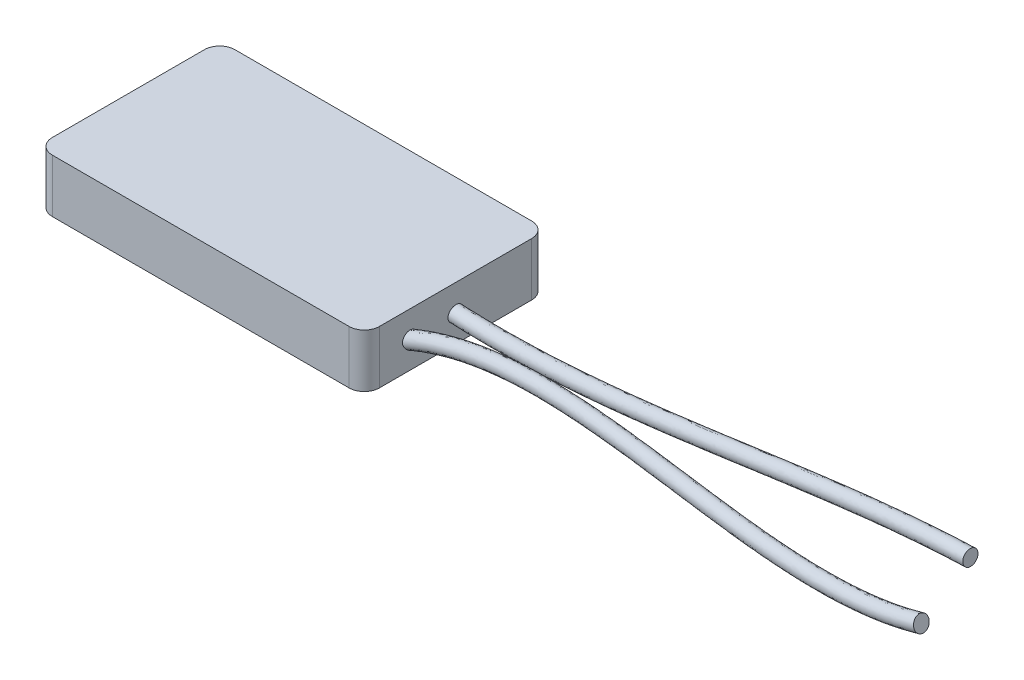
ISO-10303-21;
HEADER;
FILE_DESCRIPTION(('STEP AP214'),'2;1');
FILE_NAME('part.step','',(''),(''),'','','');
FILE_SCHEMA(('AUTOMOTIVE_DESIGN { 1 0 10303 214 1 1 1 1 }'));
ENDSEC;
DATA;
#1=APPLICATION_CONTEXT('core data for automotive mechanical design processes');
#2=APPLICATION_PROTOCOL_DEFINITION('international standard','automotive_design',2000,#1);
#3=PRODUCT_CONTEXT('',#1,'mechanical');
#4=PRODUCT('Part','Part','',(#3));
#5=PRODUCT_RELATED_PRODUCT_CATEGORY('part','',(#4));
#6=PRODUCT_DEFINITION_FORMATION('','',#4);
#7=PRODUCT_DEFINITION_CONTEXT('part definition',#1,'design');
#8=PRODUCT_DEFINITION('design','',#6,#7);
#9=PRODUCT_DEFINITION_SHAPE('','',#8);
#10=(LENGTH_UNIT() NAMED_UNIT(*) SI_UNIT(.MILLI.,.METRE.));
#11=(NAMED_UNIT(*) PLANE_ANGLE_UNIT() SI_UNIT($,.RADIAN.));
#12=(NAMED_UNIT(*) SI_UNIT($,.STERADIAN.) SOLID_ANGLE_UNIT());
#13=UNCERTAINTY_MEASURE_WITH_UNIT(LENGTH_MEASURE(1.E-05),#10,'distance_accuracy_value','');
#14=(GEOMETRIC_REPRESENTATION_CONTEXT(3) GLOBAL_UNCERTAINTY_ASSIGNED_CONTEXT((#13)) GLOBAL_UNIT_ASSIGNED_CONTEXT((#10,
#11,#12)) REPRESENTATION_CONTEXT('',''));
#15=CARTESIAN_POINT('',(0.,0.,0.));
#16=DIRECTION('',(0.,0.,1.));
#17=DIRECTION('',(1.,0.,0.));
#18=AXIS2_PLACEMENT_3D('',#15,#16,#17);
#19=CARTESIAN_POINT('',(10.75,3.5,4.99999999999999));
#20=DIRECTION('',(-1.,0.,0.));
#21=DIRECTION('',(0.,0.,1.));
#22=AXIS2_PLACEMENT_3D('',#19,#20,#21);
#23=PLANE('',#22);
#24=DIRECTION('',(0.,0.,1.));
#25=VECTOR('',#24,1.);
#26=CARTESIAN_POINT('',(10.75,1.74999999999996,4.99999999999999));
#27=LINE('',#26,#25);
#28=CARTESIAN_POINT('',(10.75,1.74999999999996,-0.5));
#29=VERTEX_POINT('',#28);
#30=CARTESIAN_POINT('',(10.75,1.74999999999996,0.5));
#31=VERTEX_POINT('',#30);
#32=EDGE_CURVE('E136',#29,#31,#27,.T.);
#33=ORIENTED_EDGE('',*,*,#32,.F.);
#34=CARTESIAN_POINT('',(10.75,1.74999999999996,-0.5));
#35=CARTESIAN_POINT('',(10.75,1.72181741917708,-0.500023785054452));
#36=CARTESIAN_POINT('',(10.75,1.69364178108827,-0.497623974888977));
#37=CARTESIAN_POINT('',(10.75,1.63810632293729,-0.488152143746487));
#38=CARTESIAN_POINT('',(10.75,1.6107459464219,-0.481083389594952));
#39=CARTESIAN_POINT('',(10.75,1.55758872581576,-0.462443770775175));
#40=CARTESIAN_POINT('',(10.75,1.5317926313849,-0.450870766911956));
#41=CARTESIAN_POINT('',(10.75,1.48251569340367,-0.423559948086439));
#42=CARTESIAN_POINT('',(10.75,1.45903437558522,-0.407822988709773));
#43=CARTESIAN_POINT('',(10.75,1.4150747842776,-0.372646198933193));
#44=CARTESIAN_POINT('',(10.75,1.39459319502428,-0.353210512444183));
#45=CARTESIAN_POINT('',(10.75,1.35715874709685,-0.311145551769514));
#46=CARTESIAN_POINT('',(10.75,1.34021087632415,-0.288511838059506));
#47=CARTESIAN_POINT('',(10.75,1.31040421899986,-0.240777292531718));
#48=CARTESIAN_POINT('',(10.75,1.29753496887906,-0.215682993678822));
#49=CARTESIAN_POINT('',(10.75,1.27617514541598,-0.163646107788774));
#50=CARTESIAN_POINT('',(10.75,1.26769189050958,-0.13670051600709));
#51=CARTESIAN_POINT('',(10.75,1.25538594858809,-0.0817929829988339));
#52=CARTESIAN_POINT('',(10.75,1.25155872614001,-0.0538320582000836));
#53=CARTESIAN_POINT('',(10.75,1.24866165947707,0.0022882190570369));
#54=CARTESIAN_POINT('',(10.75,1.24958388776724,0.0304471625701267));
#55=CARTESIAN_POINT('',(10.75,1.25614451312447,0.086239560447965));
#56=CARTESIAN_POINT('',(10.75,1.26178773330775,0.113872447837342));
#57=CARTESIAN_POINT('',(10.75,1.27762456987448,0.167761575046105));
#58=CARTESIAN_POINT('',(10.75,1.28781210716232,0.194019601803649));
#59=CARTESIAN_POINT('',(10.75,1.31245707275448,0.244478763463588));
#60=CARTESIAN_POINT('',(10.75,1.32691839325167,0.268677997409771));
#61=CARTESIAN_POINT('',(10.75,1.35969462626511,0.314306493153973));
#62=CARTESIAN_POINT('',(10.75,1.37800936324578,0.335735881055674));
#63=CARTESIAN_POINT('',(10.75,1.41798952484676,0.375238260330686));
#64=CARTESIAN_POINT('',(10.75,1.43965786576218,0.393308300019311));
#65=CARTESIAN_POINT('',(10.75,1.48571741787069,0.425557599165117));
#66=CARTESIAN_POINT('',(10.75,1.51010851256204,0.439737025004995));
#67=CARTESIAN_POINT('',(10.75,1.5609677266025,0.463830597988614));
#68=CARTESIAN_POINT('',(10.75,1.5874396417955,0.473736725781164));
#69=CARTESIAN_POINT('',(10.75,1.64163719447065,0.488949348212263));
#70=CARTESIAN_POINT('',(10.75,1.66936085955286,0.494262830519985));
#71=CARTESIAN_POINT('',(10.75,1.71482097317971,0.499076419694177));
#72=CARTESIAN_POINT('',(10.75,1.73241510990828,0.500007441371513));
#73=CARTESIAN_POINT('',(10.75,1.74999999999996,0.5));
#74=B_SPLINE_CURVE_WITH_KNOTS('',3,(#34,#35,#36,#37,#38,#39,#40,#41,#42,#43,#44,#45,#46,#47,#48,
#49,#50,#51,#52,#53,#54,#55,#56,#57,#58,#59,#60,#61,#62,#63,#64,#65,#66,#67,#68,#69,#70,#71,#72,
#73),.UNSPECIFIED.,.F.,.F.,(4,2,2,2,2,2,2,2,2,2,2,2,2,2,2,2,2,2,2,4),(0.,0.0844358442030547,
0.168812671767809,0.253229621258723,0.337629238691978,0.42193484888099,0.506358664056075,
0.590564105770283,0.674909602189799,0.759172871853978,0.843295540012755,0.927504255680808,
1.01160065860107,1.09577388652779,1.17994328092171,1.26418628462032,1.34842568509224,
1.43282249026711,1.51709065927045,1.5698452343646),.UNSPECIFIED.);
#75=EDGE_CURVE('E161',#29,#31,#74,.T.);
#76=ORIENTED_EDGE('',*,*,#75,.T.);
#77=EDGE_LOOP('',(#33,#76));
#78=FACE_BOUND('',#77,.T.);
#79=DIRECTION('',(0.,0.,-1.));
#80=VECTOR('',#79,1.);
#81=CARTESIAN_POINT('',(10.75,0.,4.99999999999999));
#82=LINE('',#81,#80);
#83=CARTESIAN_POINT('',(10.75,0.,4.99999999999999));
#84=VERTEX_POINT('',#83);
#85=CARTESIAN_POINT('',(10.75,0.,-4.99999999999999));
#86=VERTEX_POINT('',#85);
#87=EDGE_CURVE('E307',#84,#86,#82,.T.);
#88=ORIENTED_EDGE('',*,*,#87,.T.);
#89=DIRECTION('',(0.,-1.,0.));
#90=VECTOR('',#89,1.);
#91=CARTESIAN_POINT('',(10.75,3.5,-4.99999999999999));
#92=LINE('',#91,#90);
#93=CARTESIAN_POINT('',(10.75,3.5,-4.99999999999999));
#94=VERTEX_POINT('',#93);
#95=EDGE_CURVE('E266',#94,#86,#92,.T.);
#96=ORIENTED_EDGE('',*,*,#95,.F.);
#97=DIRECTION('',(0.,0.,-1.));
#98=VECTOR('',#97,1.);
#99=CARTESIAN_POINT('',(10.75,3.5,4.99999999999999));
#100=LINE('',#99,#98);
#101=CARTESIAN_POINT('',(10.75,3.5,4.99999999999999));
#102=VERTEX_POINT('',#101);
#103=EDGE_CURVE('E294',#102,#94,#100,.T.);
#104=ORIENTED_EDGE('',*,*,#103,.F.);
#105=DIRECTION('',(0.,-1.,0.));
#106=VECTOR('',#105,1.);
#107=CARTESIAN_POINT('',(10.75,3.5,4.99999999999999));
#108=LINE('',#107,#106);
#109=EDGE_CURVE('E269',#102,#84,#108,.T.);
#110=ORIENTED_EDGE('',*,*,#109,.T.);
#111=EDGE_LOOP('',(#88,#96,#104,#110));
#112=FACE_BOUND('',#111,.T.);
#113=DIRECTION('',(0.,0.,-1.));
#114=VECTOR('',#113,1.);
#115=CARTESIAN_POINT('',(10.75,1.74999999999997,4.99999999999999));
#116=LINE('',#115,#114);
#117=CARTESIAN_POINT('',(10.75,1.74999999999997,3.5));
#118=VERTEX_POINT('',#117);
#119=CARTESIAN_POINT('',(10.75,1.75000000001283,2.5));
#120=VERTEX_POINT('',#119);
#121=EDGE_CURVE('E12',#118,#120,#116,.T.);
#122=ORIENTED_EDGE('',*,*,#121,.F.);
#123=CARTESIAN_POINT('',(10.75,1.75000000001284,3.5));
#124=CARTESIAN_POINT('',(10.75,1.78247486726504,3.50001489875257));
#125=CARTESIAN_POINT('',(10.75,1.81496040205785,3.49731725958554));
#126=CARTESIAN_POINT('',(10.75,1.87910119957976,3.48657182431885));
#127=CARTESIAN_POINT('',(10.75,1.91075461664858,3.47851303249838));
#128=CARTESIAN_POINT('',(10.75,1.97228181478387,3.45710572348813));
#129=CARTESIAN_POINT('',(10.75,2.00215301831415,3.44374974881708));
#130=CARTESIAN_POINT('',(10.75,2.05905736625552,3.41198817333901));
#131=CARTESIAN_POINT('',(10.75,2.08609325783668,3.3935875240595));
#132=CARTESIAN_POINT('',(10.75,2.13517858757019,3.35308277613139));
#133=CARTESIAN_POINT('',(10.75,2.15740008311934,3.3311877312923));
#134=CARTESIAN_POINT('',(10.75,2.19746915146851,3.28369324570609));
#135=CARTESIAN_POINT('',(10.75,2.21531802488397,3.25809491009708));
#136=CARTESIAN_POINT('',(10.75,2.24461536706111,3.2061133072119));
#137=CARTESIAN_POINT('',(10.75,2.25645851366234,3.17995240395459));
#138=CARTESIAN_POINT('',(10.75,2.27522600537008,3.12592481507081));
#139=CARTESIAN_POINT('',(10.7500000000001,2.28215301752151,3.09805906326605));
#140=CARTESIAN_POINT('',(10.7500000000001,2.29048409431419,3.04341059821431));
#141=CARTESIAN_POINT('',(10.75,2.29222407305103,3.01667867750367));
#142=CARTESIAN_POINT('',(10.75,2.29106879265793,2.96331752052784));
#143=CARTESIAN_POINT('',(10.75,2.2881743433816,2.93668826713692));
#144=CARTESIAN_POINT('',(10.75,2.27800221284413,2.88497191873653));
#145=CARTESIAN_POINT('',(10.75,2.2708347870596,2.85986296751515));
#146=CARTESIAN_POINT('',(10.75,2.2524752194338,2.81112828282459));
#147=CARTESIAN_POINT('',(10.75,2.2412774951945,2.78750466027437));
#148=CARTESIAN_POINT('',(10.75,2.21494901364384,2.74181202907296));
#149=CARTESIAN_POINT('',(10.75,2.19973083360408,2.7197935272547));
#150=CARTESIAN_POINT('',(10.75,2.16600894861398,2.6784313360214));
#151=CARTESIAN_POINT('',(10.75,2.14750363903483,2.65908896121178));
#152=CARTESIAN_POINT('',(10.75,2.1065395901233,2.62234996815571));
#153=CARTESIAN_POINT('',(10.75,2.08390741097479,2.60514693591553));
#154=CARTESIAN_POINT('',(10.75,2.03626982321762,2.57449008066574));
#155=CARTESIAN_POINT('',(10.7500000000002,2.01126623266467,2.56103341613854));
#156=CARTESIAN_POINT('',(10.7499999999998,1.95753337829621,2.53715255279583));
#157=CARTESIAN_POINT('',(10.7499999999992,1.9286654561424,2.52704044764955));
#158=CARTESIAN_POINT('',(10.7500000000008,1.86973017876078,2.51150322257651));
#159=CARTESIAN_POINT('',(10.7500000000028,1.83966413654318,2.50607311185676));
#160=CARTESIAN_POINT('',(10.7499999999997,1.7896414493491,2.50099799137806));
#161=CARTESIAN_POINT('',(10.7499999999968,1.76981520893317,2.49999601549057));
#162=CARTESIAN_POINT('',(10.7499999999908,1.75000000001088,2.5));
#163=B_SPLINE_CURVE_WITH_KNOTS('',3,(#123,#124,#125,#126,#127,#128,#129,#130,#131,#132,#133,
#134,#135,#136,#137,#138,#139,#140,#141,#142,#143,#144,#145,#146,#147,#148,#149,#150,#151,#152,
#153,#154,#155,#156,#157,#158,#159,#160,#161,#162),.UNSPECIFIED.,.F.,.F.,(4,2,2,2,2,2,2,2,2,2,2,
2,2,2,2,2,2,2,2,4),(0.,0.097331307208857,0.194862858868278,0.292532207597433,0.390106031501713,
0.483195811236801,0.576257868153428,0.661956560685618,0.747608725331935,0.827578585697753,
0.90753447307428,0.985511497212213,1.06359694623097,1.1435444898537,1.2235311680629,
1.30845115088392,1.393306547644,1.48467600421991,1.57594794427673,1.63539528805274),.UNSPECIFIED.);
#164=EDGE_CURVE('E67',#118,#120,#163,.T.);
#165=ORIENTED_EDGE('',*,*,#164,.T.);
#166=EDGE_LOOP('',(#122,#165));
#167=FACE_BOUND('',#166,.T.);
#168=ADVANCED_FACE('F59',(#78,#112,#167),#23,.F.);
#169=CARTESIAN_POINT('',(-9.75,3.5,5.));
#170=DIRECTION('',(0.,-1.,0.));
#171=DIRECTION('',(0.,0.,-1.));
#172=AXIS2_PLACEMENT_3D('',#169,#170,#171);
#173=CYLINDRICAL_SURFACE('',#172,1.);
#174=CARTESIAN_POINT('',(-9.75,0.,5.));
#175=DIRECTION('',(0.,1.,0.));
#176=DIRECTION('',(0.,0.,-1.));
#177=AXIS2_PLACEMENT_3D('',#174,#175,#176);
#178=CIRCLE('',#177,1.);
#179=CARTESIAN_POINT('',(-10.75,0.,4.99999999999999));
#180=VERTEX_POINT('',#179);
#181=CARTESIAN_POINT('',(-9.74999999999999,0.,6.));
#182=VERTEX_POINT('',#181);
#183=EDGE_CURVE('E283',#180,#182,#178,.T.);
#184=ORIENTED_EDGE('',*,*,#183,.T.);
#185=DIRECTION('',(0.,-1.,0.));
#186=VECTOR('',#185,1.);
#187=CARTESIAN_POINT('',(-9.74999999999999,3.5,6.));
#188=LINE('',#187,#186);
#189=CARTESIAN_POINT('',(-9.74999999999999,3.5,6.));
#190=VERTEX_POINT('',#189);
#191=EDGE_CURVE('E274',#190,#182,#188,.T.);
#192=ORIENTED_EDGE('',*,*,#191,.F.);
#193=CARTESIAN_POINT('',(-9.75,3.5,5.));
#194=DIRECTION('',(0.,1.,0.));
#195=DIRECTION('',(0.,0.,-1.));
#196=AXIS2_PLACEMENT_3D('',#193,#194,#195);
#197=CIRCLE('',#196,1.);
#198=CARTESIAN_POINT('',(-10.75,3.5,4.99999999999999));
#199=VERTEX_POINT('',#198);
#200=EDGE_CURVE('E256',#199,#190,#197,.T.);
#201=ORIENTED_EDGE('',*,*,#200,.F.);
#202=DIRECTION('',(0.,-1.,0.));
#203=VECTOR('',#202,1.);
#204=CARTESIAN_POINT('',(-10.75,3.5,4.99999999999999));
#205=LINE('',#204,#203);
#206=EDGE_CURVE('E260',#199,#180,#205,.T.);
#207=ORIENTED_EDGE('',*,*,#206,.T.);
#208=EDGE_LOOP('',(#184,#192,#201,#207));
#209=FACE_BOUND('',#208,.T.);
#210=ADVANCED_FACE('F61',(#209),#173,.T.);
#211=CARTESIAN_POINT('',(-9.74999999999999,3.5,6.));
#212=DIRECTION('',(0.,0.,-1.));
#213=DIRECTION('',(-1.,0.,0.));
#214=AXIS2_PLACEMENT_3D('',#211,#212,#213);
#215=PLANE('',#214);
#216=DIRECTION('',(1.,0.,0.));
#217=VECTOR('',#216,1.);
#218=CARTESIAN_POINT('',(-9.74999999999999,0.,6.));
#219=LINE('',#218,#217);
#220=CARTESIAN_POINT('',(9.74999999999999,0.,6.));
#221=VERTEX_POINT('',#220);
#222=EDGE_CURVE('E303',#182,#221,#219,.T.);
#223=ORIENTED_EDGE('',*,*,#222,.T.);
#224=DIRECTION('',(0.,-1.,0.));
#225=VECTOR('',#224,1.);
#226=CARTESIAN_POINT('',(9.74999999999999,3.5,6.));
#227=LINE('',#226,#225);
#228=CARTESIAN_POINT('',(9.74999999999999,3.5,6.));
#229=VERTEX_POINT('',#228);
#230=EDGE_CURVE('E272',#229,#221,#227,.T.);
#231=ORIENTED_EDGE('',*,*,#230,.F.);
#232=DIRECTION('',(1.,0.,0.));
#233=VECTOR('',#232,1.);
#234=CARTESIAN_POINT('',(-9.74999999999999,3.5,6.));
#235=LINE('',#234,#233);
#236=EDGE_CURVE('E290',#190,#229,#235,.T.);
#237=ORIENTED_EDGE('',*,*,#236,.F.);
#238=ORIENTED_EDGE('',*,*,#191,.T.);
#239=EDGE_LOOP('',(#223,#231,#237,#238));
#240=FACE_BOUND('',#239,.T.);
#241=ADVANCED_FACE('F149',(#240),#215,.F.);
#242=CARTESIAN_POINT('',(9.75,3.5,5.));
#243=DIRECTION('',(0.,-1.,0.));
#244=DIRECTION('',(0.,0.,-1.));
#245=AXIS2_PLACEMENT_3D('',#242,#243,#244);
#246=CYLINDRICAL_SURFACE('',#245,1.);
#247=CARTESIAN_POINT('',(9.75,0.,5.));
#248=DIRECTION('',(0.,1.,0.));
#249=DIRECTION('',(0.,0.,1.));
#250=AXIS2_PLACEMENT_3D('',#247,#248,#249);
#251=CIRCLE('',#250,1.);
#252=EDGE_CURVE('E305',#221,#84,#251,.T.);
#253=ORIENTED_EDGE('',*,*,#252,.T.);
#254=ORIENTED_EDGE('',*,*,#109,.F.);
#255=CARTESIAN_POINT('',(9.75,3.5,5.));
#256=DIRECTION('',(0.,1.,0.));
#257=DIRECTION('',(0.,0.,1.));
#258=AXIS2_PLACEMENT_3D('',#255,#256,#257);
#259=CIRCLE('',#258,1.);
#260=EDGE_CURVE('E292',#229,#102,#259,.T.);
#261=ORIENTED_EDGE('',*,*,#260,.F.);
#262=ORIENTED_EDGE('',*,*,#230,.T.);
#263=EDGE_LOOP('',(#253,#254,#261,#262));
#264=FACE_BOUND('',#263,.T.);
#265=ADVANCED_FACE('F158',(#264),#246,.T.);
#266=CARTESIAN_POINT('',(9.75,3.5,-5.));
#267=DIRECTION('',(0.,-1.,0.));
#268=DIRECTION('',(0.,0.,-1.));
#269=AXIS2_PLACEMENT_3D('',#266,#267,#268);
#270=CYLINDRICAL_SURFACE('',#269,1.);
#271=CARTESIAN_POINT('',(9.75,0.,-5.));
#272=DIRECTION('',(0.,1.,0.));
#273=DIRECTION('',(0.,0.,-1.));
#274=AXIS2_PLACEMENT_3D('',#271,#272,#273);
#275=CIRCLE('',#274,1.);
#276=CARTESIAN_POINT('',(9.74999999999999,0.,-6.));
#277=VERTEX_POINT('',#276);
#278=EDGE_CURVE('E245',#86,#277,#275,.T.);
#279=ORIENTED_EDGE('',*,*,#278,.T.);
#280=DIRECTION('',(0.,-1.,0.));
#281=VECTOR('',#280,1.);
#282=CARTESIAN_POINT('',(9.74999999999999,3.5,-6.));
#283=LINE('',#282,#281);
#284=CARTESIAN_POINT('',(9.74999999999999,3.5,-6.));
#285=VERTEX_POINT('',#284);
#286=EDGE_CURVE('E241',#285,#277,#283,.T.);
#287=ORIENTED_EDGE('',*,*,#286,.F.);
#288=CARTESIAN_POINT('',(9.75,3.5,-5.));
#289=DIRECTION('',(0.,1.,0.));
#290=DIRECTION('',(0.,0.,-1.));
#291=AXIS2_PLACEMENT_3D('',#288,#289,#290);
#292=CIRCLE('',#291,1.);
#293=EDGE_CURVE('E296',#94,#285,#292,.T.);
#294=ORIENTED_EDGE('',*,*,#293,.F.);
#295=ORIENTED_EDGE('',*,*,#95,.T.);
#296=EDGE_LOOP('',(#279,#287,#294,#295));
#297=FACE_BOUND('',#296,.T.);
#298=ADVANCED_FACE('F156',(#297),#270,.T.);
#299=CARTESIAN_POINT('',(-9.74999999999999,3.5,-6.));
#300=DIRECTION('',(0.,0.,1.));
#301=DIRECTION('',(1.,0.,0.));
#302=AXIS2_PLACEMENT_3D('',#299,#300,#301);
#303=PLANE('',#302);
#304=DIRECTION('',(-1.,0.,0.));
#305=VECTOR('',#304,1.);
#306=CARTESIAN_POINT('',(-9.74999999999999,0.,-6.));
#307=LINE('',#306,#305);
#308=CARTESIAN_POINT('',(-9.74999999999999,0.,-6.));
#309=VERTEX_POINT('',#308);
#310=EDGE_CURVE('E235',#277,#309,#307,.T.);
#311=ORIENTED_EDGE('',*,*,#310,.T.);
#312=DIRECTION('',(0.,-1.,0.));
#313=VECTOR('',#312,1.);
#314=CARTESIAN_POINT('',(-9.74999999999999,3.5,-6.));
#315=LINE('',#314,#313);
#316=CARTESIAN_POINT('',(-9.74999999999999,3.5,-6.));
#317=VERTEX_POINT('',#316);
#318=EDGE_CURVE('E238',#317,#309,#315,.T.);
#319=ORIENTED_EDGE('',*,*,#318,.F.);
#320=DIRECTION('',(-1.,0.,0.));
#321=VECTOR('',#320,1.);
#322=CARTESIAN_POINT('',(-9.74999999999999,3.5,-6.));
#323=LINE('',#322,#321);
#324=EDGE_CURVE('E298',#285,#317,#323,.T.);
#325=ORIENTED_EDGE('',*,*,#324,.F.);
#326=ORIENTED_EDGE('',*,*,#286,.T.);
#327=EDGE_LOOP('',(#311,#319,#325,#326));
#328=FACE_BOUND('',#327,.T.);
#329=ADVANCED_FACE('F224',(#328),#303,.F.);
#330=CARTESIAN_POINT('',(-9.75,3.5,-5.));
#331=DIRECTION('',(0.,-1.,0.));
#332=DIRECTION('',(0.,0.,-1.));
#333=AXIS2_PLACEMENT_3D('',#330,#331,#332);
#334=CYLINDRICAL_SURFACE('',#333,1.);
#335=CARTESIAN_POINT('',(-9.75,0.,-5.));
#336=DIRECTION('',(0.,1.,0.));
#337=DIRECTION('',(0.,0.,-1.));
#338=AXIS2_PLACEMENT_3D('',#335,#336,#337);
#339=CIRCLE('',#338,1.);
#340=CARTESIAN_POINT('',(-10.75,0.,-4.99999999999999));
#341=VERTEX_POINT('',#340);
#342=EDGE_CURVE('E244',#309,#341,#339,.T.);
#343=ORIENTED_EDGE('',*,*,#342,.T.);
#344=DIRECTION('',(0.,-1.,0.));
#345=VECTOR('',#344,1.);
#346=CARTESIAN_POINT('',(-10.75,3.5,-4.99999999999999));
#347=LINE('',#346,#345);
#348=CARTESIAN_POINT('',(-10.75,3.5,-4.99999999999999));
#349=VERTEX_POINT('',#348);
#350=EDGE_CURVE('E250',#349,#341,#347,.T.);
#351=ORIENTED_EDGE('',*,*,#350,.F.);
#352=CARTESIAN_POINT('',(-9.75,3.5,-5.));
#353=DIRECTION('',(0.,1.,0.));
#354=DIRECTION('',(0.,0.,-1.));
#355=AXIS2_PLACEMENT_3D('',#352,#353,#354);
#356=CIRCLE('',#355,1.);
#357=EDGE_CURVE('E249',#317,#349,#356,.T.);
#358=ORIENTED_EDGE('',*,*,#357,.F.);
#359=ORIENTED_EDGE('',*,*,#318,.T.);
#360=EDGE_LOOP('',(#343,#351,#358,#359));
#361=FACE_BOUND('',#360,.T.);
#362=ADVANCED_FACE('F221',(#361),#334,.T.);
#363=CARTESIAN_POINT('',(-10.75,3.5,4.99999999999999));
#364=DIRECTION('',(1.,0.,0.));
#365=DIRECTION('',(0.,0.,-1.));
#366=AXIS2_PLACEMENT_3D('',#363,#364,#365);
#367=PLANE('',#366);
#368=DIRECTION('',(0.,0.,1.));
#369=VECTOR('',#368,1.);
#370=CARTESIAN_POINT('',(-10.75,0.,4.99999999999999));
#371=LINE('',#370,#369);
#372=EDGE_CURVE('E254',#341,#180,#371,.T.);
#373=ORIENTED_EDGE('',*,*,#372,.T.);
#374=ORIENTED_EDGE('',*,*,#206,.F.);
#375=DIRECTION('',(0.,0.,1.));
#376=VECTOR('',#375,1.);
#377=CARTESIAN_POINT('',(-10.75,3.5,4.99999999999999));
#378=LINE('',#377,#376);
#379=EDGE_CURVE('E263',#349,#199,#378,.T.);
#380=ORIENTED_EDGE('',*,*,#379,.F.);
#381=ORIENTED_EDGE('',*,*,#350,.T.);
#382=EDGE_LOOP('',(#373,#374,#380,#381));
#383=FACE_BOUND('',#382,.T.);
#384=ADVANCED_FACE('F214',(#383),#367,.F.);
#385=CARTESIAN_POINT('',(-9.75,3.5,5.));
#386=DIRECTION('',(0.,-1.,0.));
#387=DIRECTION('',(0.,0.,-1.));
#388=AXIS2_PLACEMENT_3D('',#385,#386,#387);
#389=PLANE('',#388);
#390=ORIENTED_EDGE('',*,*,#200,.T.);
#391=ORIENTED_EDGE('',*,*,#236,.T.);
#392=ORIENTED_EDGE('',*,*,#260,.T.);
#393=ORIENTED_EDGE('',*,*,#103,.T.);
#394=ORIENTED_EDGE('',*,*,#293,.T.);
#395=ORIENTED_EDGE('',*,*,#324,.T.);
#396=ORIENTED_EDGE('',*,*,#357,.T.);
#397=ORIENTED_EDGE('',*,*,#379,.T.);
#398=EDGE_LOOP('',(#390,#391,#392,#393,#394,#395,#396,#397));
#399=FACE_BOUND('',#398,.T.);
#400=ADVANCED_FACE('F211',(#399),#389,.F.);
#401=CARTESIAN_POINT('',(-9.75,0.,5.));
#402=DIRECTION('',(0.,-1.,0.));
#403=DIRECTION('',(0.,0.,-1.));
#404=AXIS2_PLACEMENT_3D('',#401,#402,#403);
#405=PLANE('',#404);
#406=ORIENTED_EDGE('',*,*,#183,.F.);
#407=ORIENTED_EDGE('',*,*,#372,.F.);
#408=ORIENTED_EDGE('',*,*,#342,.F.);
#409=ORIENTED_EDGE('',*,*,#310,.F.);
#410=ORIENTED_EDGE('',*,*,#278,.F.);
#411=ORIENTED_EDGE('',*,*,#87,.F.);
#412=ORIENTED_EDGE('',*,*,#252,.F.);
#413=ORIENTED_EDGE('',*,*,#222,.F.);
#414=EDGE_LOOP('',(#406,#407,#408,#409,#410,#411,#412,#413));
#415=FACE_BOUND('',#414,.T.);
#416=ADVANCED_FACE('F209',(#415),#405,.T.);
#417=CARTESIAN_POINT('',(10.75,1.75,0.));
#418=DIRECTION('',(0.998880508858223,-0.0473046406089031,0.));
#419=DIRECTION('',(0.0473046406089031,0.998880508858223,0.));
#420=AXIS2_PLACEMENT_3D('',#417,#418,#419);
#421=PLANE('',#420);
#422=CARTESIAN_POINT('',(10.75,1.75,0.));
#423=DIRECTION('',(0.998880508858223,-0.0473046406089031,0.));
#424=DIRECTION('',(0.0473046406089031,0.998880508858223,0.));
#425=AXIS2_PLACEMENT_3D('',#422,#423,#424);
#426=CIRCLE('',#425,0.5);
#427=EDGE_CURVE('E79',#29,#31,#426,.T.);
#428=ORIENTED_EDGE('',*,*,#427,.F.);
#429=ORIENTED_EDGE('',*,*,#32,.T.);
#430=EDGE_LOOP('',(#428,#429));
#431=FACE_BOUND('',#430,.T.);
#432=ADVANCED_FACE('F197',(#431),#421,.F.);
#433=CARTESIAN_POINT('',(10.7736523203045,2.24944025442911,0.));
#434=CARTESIAN_POINT('',(22.028626523367,1.71643104916205,0.));
#435=CARTESIAN_POINT('',(33.1547737074439,4.84297756328523,0.));
#436=CARTESIAN_POINT('',(44.5599889746685,5.26163674732241,0.));
#437=CARTESIAN_POINT('',(10.7736523203045,2.24944025442911,1.));
#438=CARTESIAN_POINT('',(22.028626523367,1.71643104916205,1.));
#439=CARTESIAN_POINT('',(33.1547737074439,4.84297756328523,1.));
#440=CARTESIAN_POINT('',(44.5599889746685,5.26163674732241,1.));
#441=CARTESIAN_POINT('',(10.7263476796955,1.25055974557089,1.));
#442=CARTESIAN_POINT('',(22.1954655465855,0.707409198296256,1.));
#443=CARTESIAN_POINT('',(33.3515644026737,3.84952779585448,1.));
#444=CARTESIAN_POINT('',(44.5966719651242,4.26230979471319,1.));
#445=CARTESIAN_POINT('',(10.7263476796955,1.25055974557089,0.));
#446=CARTESIAN_POINT('',(22.1954655465855,0.707409198296256,0.));
#447=CARTESIAN_POINT('',(33.3515644026737,3.84952779584711,0.));
#448=CARTESIAN_POINT('',(44.5966719651242,4.26230979471319,0.));
#449=CARTESIAN_POINT('',(10.7263476796955,1.25055974557089,-1.));
#450=CARTESIAN_POINT('',(22.1954655465855,0.707409198296255,-1.));
#451=CARTESIAN_POINT('',(33.3515644026737,3.84952779583973,-1.));
#452=CARTESIAN_POINT('',(44.5966719651242,4.26230979471319,-1.));
#453=CARTESIAN_POINT('',(10.7736523203045,2.24944025442911,-1.));
#454=CARTESIAN_POINT('',(22.028626523367,1.71643104916205,-1.));
#455=CARTESIAN_POINT('',(33.1547737074439,4.84297756328523,-1.));
#456=CARTESIAN_POINT('',(44.5599889746685,5.26163674732241,-1.));
#457=CARTESIAN_POINT('',(10.7736523203045,2.24944025442911,0.));
#458=CARTESIAN_POINT('',(22.028626523367,1.71643104916205,0.));
#459=CARTESIAN_POINT('',(33.1547737074439,4.84297756328523,0.));
#460=CARTESIAN_POINT('',(44.5599889746685,5.26163674732241,0.));
#461=(BOUNDED_SURFACE() B_SPLINE_SURFACE(3,3,((#433,#434,#435,#436),(#437,#438,#439,#440),(#441,
#442,#443,#444),(#445,#446,#447,#448),(#449,#450,#451,#452),(#453,#454,#455,#456),(#457,#458,
#459,#460)),.UNSPECIFIED.,.T.,.F.,.F.) B_SPLINE_SURFACE_WITH_KNOTS((4,3,4),(4,4),(0.,0.5,1.),
(0.,1.),.UNSPECIFIED.) GEOMETRIC_REPRESENTATION_ITEM() RATIONAL_B_SPLINE_SURFACE(((1.,1.,1.,1.),
(0.333333333333333,0.333333333333333,0.333333333333333,0.333333333333333),(0.333333333333333,
0.333333333333333,0.333333333333333,0.333333333333333),(1.,1.,1.,1.),(0.333333333333333,
0.333333333333333,0.333333333333333,0.333333333333333),(0.333333333333333,0.333333333333333,
0.333333333333333,0.333333333333333),(1.,1.,1.,1.))) REPRESENTATION_ITEM('') SURFACE());
#462=CARTESIAN_POINT('',(44.5783304698963,4.76197327101779,0.));
#463=DIRECTION('',(0.99932695260922,0.0366829904556461,0.));
#464=DIRECTION('',(-0.0366829904556461,0.99932695260922,0.));
#465=AXIS2_PLACEMENT_3D('',#462,#463,#464);
#466=CIRCLE('',#465,0.5);
#467=CARTESIAN_POINT('',(44.5599889746685,5.2616367473224,0.));
#468=VERTEX_POINT('',#467);
#469=EDGE_CURVE('E280',#468,#468,#466,.T.);
#470=ORIENTED_EDGE('',*,*,#469,.F.);
#471=EDGE_LOOP('',(#470));
#472=FACE_BOUND('',#471,.T.);
#473=ORIENTED_EDGE('',*,*,#75,.F.);
#474=ORIENTED_EDGE('',*,*,#427,.T.);
#475=EDGE_LOOP('',(#473,#474));
#476=FACE_BOUND('',#475,.T.);
#477=ADVANCED_FACE('F191',(#472,#476),#461,.T.);
#478=CARTESIAN_POINT('',(44.5783304698963,4.76197327101779,0.));
#479=DIRECTION('',(0.99932695260922,0.0366829904556461,0.));
#480=DIRECTION('',(-0.0366829904556461,0.99932695260922,0.));
#481=AXIS2_PLACEMENT_3D('',#478,#479,#480);
#482=PLANE('',#481);
#483=ORIENTED_EDGE('',*,*,#469,.T.);
#484=EDGE_LOOP('',(#483));
#485=FACE_BOUND('',#484,.T.);
#486=ADVANCED_FACE('F190',(#485),#482,.T.);
#487=CARTESIAN_POINT('',(10.75,1.74999999999996,3.));
#488=DIRECTION('',(0.920878760093869,0.389849085170119,0.));
#489=DIRECTION('',(-0.389849085170119,0.920878760093869,0.));
#490=AXIS2_PLACEMENT_3D('',#487,#488,#489);
#491=PLANE('',#490);
#492=CARTESIAN_POINT('',(10.75,1.74999999999996,3.));
#493=DIRECTION('',(0.920878760093869,0.389849085170119,0.));
#494=DIRECTION('',(-0.389849085170119,0.920878760093869,0.));
#495=AXIS2_PLACEMENT_3D('',#492,#493,#494);
#496=CIRCLE('',#495,0.5);
#497=EDGE_CURVE('E73',#118,#120,#496,.T.);
#498=ORIENTED_EDGE('',*,*,#497,.F.);
#499=ORIENTED_EDGE('',*,*,#121,.T.);
#500=EDGE_LOOP('',(#498,#499));
#501=FACE_BOUND('',#500,.T.);
#502=ADVANCED_FACE('F138',(#501),#491,.F.);
#503=CARTESIAN_POINT('',(10.5550754574149,2.2104393800469,3.));
#504=CARTESIAN_POINT('',(16.2283669651612,4.61219691280045,2.99999999998046));
#505=CARTESIAN_POINT('',(21.9279819284803,3.95115605243397,3.));
#506=CARTESIAN_POINT('',(33.1682848778749,2.30363142676226,3.));
#507=CARTESIAN_POINT('',(38.7216085325346,1.3230332400631,3.));
#508=CARTESIAN_POINT('',(44.219909658997,2.88532612925528,3.));
#509=CARTESIAN_POINT('',(10.5550754574149,2.2104393800469,4.));
#510=CARTESIAN_POINT('',(16.2283669651612,4.61219691280045,3.9999999999772));
#511=CARTESIAN_POINT('',(21.9279819284803,3.95115605243397,4.));
#512=CARTESIAN_POINT('',(33.1682848778749,2.30363142676226,4.));
#513=CARTESIAN_POINT('',(38.7216085325346,1.3230332400631,4.));
#514=CARTESIAN_POINT('',(44.219909658997,2.88532612925528,4.));
#515=CARTESIAN_POINT('',(10.9449245425851,1.28956061995303,4.));
#516=CARTESIAN_POINT('',(16.3358022809053,3.57175979795564,3.9999999999772));
#517=CARTESIAN_POINT('',(21.8038365232562,2.95866767716839,4.));
#518=CARTESIAN_POINT('',(33.0023834095006,1.31726336177864,4.));
#519=CARTESIAN_POINT('',(38.7202603844469,0.283065586378242,4.));
#520=CARTESIAN_POINT('',(44.4932313526725,1.92340344433389,4.));
#521=CARTESIAN_POINT('',(10.9449245425851,1.28956061995303,3.));
#522=CARTESIAN_POINT('',(16.3358022809053,3.57175979795564,2.99999999998046));
#523=CARTESIAN_POINT('',(21.8038365232562,2.95866767716716,3.));
#524=CARTESIAN_POINT('',(33.0023834095006,1.31726336177987,3.));
#525=CARTESIAN_POINT('',(38.7202603844469,0.283065586378242,3.));
#526=CARTESIAN_POINT('',(44.4932313526725,1.92340344433389,3.));
#527=CARTESIAN_POINT('',(10.9449245425851,1.28956061995303,2.));
#528=CARTESIAN_POINT('',(16.3358022809053,3.57175979795564,1.99999999998372));
#529=CARTESIAN_POINT('',(21.8038365232562,2.95866767716593,2.));
#530=CARTESIAN_POINT('',(33.0023834095006,1.3172633617811,2.));
#531=CARTESIAN_POINT('',(38.7202603844469,0.283065586378242,2.));
#532=CARTESIAN_POINT('',(44.4932313526725,1.92340344433389,2.));
#533=CARTESIAN_POINT('',(10.5550754574149,2.2104393800469,2.));
#534=CARTESIAN_POINT('',(16.2283669651612,4.61219691280045,1.99999999998372));
#535=CARTESIAN_POINT('',(21.9279819284803,3.95115605243397,2.));
#536=CARTESIAN_POINT('',(33.1682848778749,2.30363142676226,2.));
#537=CARTESIAN_POINT('',(38.7216085325346,1.3230332400631,2.));
#538=CARTESIAN_POINT('',(44.219909658997,2.88532612925528,2.));
#539=CARTESIAN_POINT('',(10.5550754574149,2.2104393800469,3.));
#540=CARTESIAN_POINT('',(16.2283669651612,4.61219691280045,2.99999999998046));
#541=CARTESIAN_POINT('',(21.9279819284803,3.95115605243397,3.));
#542=CARTESIAN_POINT('',(33.1682848778749,2.30363142676226,3.));
#543=CARTESIAN_POINT('',(38.7216085325346,1.3230332400631,3.));
#544=CARTESIAN_POINT('',(44.219909658997,2.88532612925528,3.));
#545=(BOUNDED_SURFACE() B_SPLINE_SURFACE(3,3,((#503,#504,#505,#506,#507,#508),(#509,#510,#511,
#512,#513,#514),(#515,#516,#517,#518,#519,#520),(#521,#522,#523,#524,#525,#526),(#527,#528,#529,
#530,#531,#532),(#533,#534,#535,#536,#537,#538),(#539,#540,#541,#542,#543,#544)),.UNSPECIFIED.,
.T.,.F.,.F.) B_SPLINE_SURFACE_WITH_KNOTS((4,3,4),(4,2,4),(0.,0.5,1.),(0.,0.5,1.),
.UNSPECIFIED.) GEOMETRIC_REPRESENTATION_ITEM() RATIONAL_B_SPLINE_SURFACE(((1.,1.,1.,1.,1.,1.),
(0.333333333333333,0.333333333333333,0.333333333333333,0.333333333333333,0.333333333333333,
0.333333333333333),(0.333333333333333,0.333333333333333,0.333333333333333,0.333333333333333,
0.333333333333333,0.333333333333333),(1.,1.,1.,1.,1.,1.),(0.333333333333333,0.333333333333333,
0.333333333333333,0.333333333333333,0.333333333333333,0.333333333333333),(0.333333333333333,
0.333333333333333,0.333333333333333,0.333333333333333,0.333333333333333,0.333333333333333),(1.,
1.,1.,1.,1.,1.))) REPRESENTATION_ITEM('') SURFACE());
#546=CARTESIAN_POINT('',(44.3565705058347,2.40436478679459,3.));
#547=DIRECTION('',(0.961922684921391,0.273321693675459,0.));
#548=DIRECTION('',(-0.273321693675459,0.961922684921391,0.));
#549=AXIS2_PLACEMENT_3D('',#546,#547,#548);
#550=CIRCLE('',#549,0.5);
#551=CARTESIAN_POINT('',(44.219909658997,2.88532612925528,3.));
#552=VERTEX_POINT('',#551);
#553=EDGE_CURVE('E139',#552,#552,#550,.T.);
#554=ORIENTED_EDGE('',*,*,#553,.F.);
#555=EDGE_LOOP('',(#554));
#556=FACE_BOUND('',#555,.T.);
#557=ORIENTED_EDGE('',*,*,#164,.F.);
#558=ORIENTED_EDGE('',*,*,#497,.T.);
#559=EDGE_LOOP('',(#557,#558));
#560=FACE_BOUND('',#559,.T.);
#561=ADVANCED_FACE('F133',(#556,#560),#545,.T.);
#562=CARTESIAN_POINT('',(44.3565705058347,2.40436478679459,3.));
#563=DIRECTION('',(0.961922684921391,0.273321693675459,0.));
#564=DIRECTION('',(-0.273321693675459,0.961922684921391,0.));
#565=AXIS2_PLACEMENT_3D('',#562,#563,#564);
#566=PLANE('',#565);
#567=ORIENTED_EDGE('',*,*,#553,.T.);
#568=EDGE_LOOP('',(#567));
#569=FACE_BOUND('',#568,.T.);
#570=ADVANCED_FACE('F179',(#569),#566,.T.);
#571=CLOSED_SHELL('',(#168,#210,#241,#265,#298,#329,#362,#384,#400,#416,#432,#477,#486,#502,
#561,#570));
#572=MANIFOLD_SOLID_BREP('B2',#571);
#573=ADVANCED_BREP_SHAPE_REPRESENTATION('',(#18,#572),#14);
#574=SHAPE_DEFINITION_REPRESENTATION(#9,#573);
ENDSEC;
END-ISO-10303-21;
